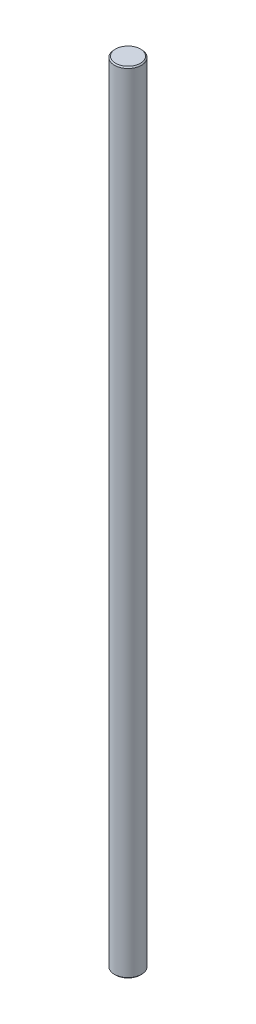
ISO-10303-21;
HEADER;
FILE_DESCRIPTION(('STEP AP214'),'2;1');
FILE_NAME('part.step','',(''),(''),'','','');
FILE_SCHEMA(('AUTOMOTIVE_DESIGN { 1 0 10303 214 1 1 1 1 }'));
ENDSEC;
DATA;
#1=APPLICATION_CONTEXT('core data for automotive mechanical design processes');
#2=APPLICATION_PROTOCOL_DEFINITION('international standard','automotive_design',2000,#1);
#3=PRODUCT_CONTEXT('',#1,'mechanical');
#4=PRODUCT('Part','Part','',(#3));
#5=PRODUCT_RELATED_PRODUCT_CATEGORY('part','',(#4));
#6=PRODUCT_DEFINITION_FORMATION('','',#4);
#7=PRODUCT_DEFINITION_CONTEXT('part definition',#1,'design');
#8=PRODUCT_DEFINITION('design','',#6,#7);
#9=PRODUCT_DEFINITION_SHAPE('','',#8);
#10=(LENGTH_UNIT() NAMED_UNIT(*) SI_UNIT(.MILLI.,.METRE.));
#11=(NAMED_UNIT(*) PLANE_ANGLE_UNIT() SI_UNIT($,.RADIAN.));
#12=(NAMED_UNIT(*) SI_UNIT($,.STERADIAN.) SOLID_ANGLE_UNIT());
#13=UNCERTAINTY_MEASURE_WITH_UNIT(LENGTH_MEASURE(1.E-05),#10,'distance_accuracy_value','');
#14=(GEOMETRIC_REPRESENTATION_CONTEXT(3) GLOBAL_UNCERTAINTY_ASSIGNED_CONTEXT((#13)) GLOBAL_UNIT_ASSIGNED_CONTEXT((#10,
#11,#12)) REPRESENTATION_CONTEXT('',''));
#15=CARTESIAN_POINT('',(0.,0.,0.));
#16=DIRECTION('',(0.,0.,1.));
#17=DIRECTION('',(1.,0.,0.));
#18=AXIS2_PLACEMENT_3D('',#15,#16,#17);
#19=CARTESIAN_POINT('',(0.,175.,0.));
#20=DIRECTION('',(0.,-1.,0.));
#21=DIRECTION('',(0.,0.,-1.));
#22=AXIS2_PLACEMENT_3D('',#19,#20,#21);
#23=CYLINDRICAL_SURFACE('',#22,6.);
#24=CARTESIAN_POINT('',(0.,-174.5,0.));
#25=DIRECTION('',(0.,1.,0.));
#26=DIRECTION('',(0.,0.,1.));
#27=AXIS2_PLACEMENT_3D('',#24,#25,#26);
#28=CIRCLE('',#27,6.);
#29=CARTESIAN_POINT('',(0.,-174.5,6.));
#30=VERTEX_POINT('',#29);
#31=EDGE_CURVE('E46',#30,#30,#28,.T.);
#32=ORIENTED_EDGE('',*,*,#31,.T.);
#33=EDGE_LOOP('',(#32));
#34=FACE_BOUND('',#33,.T.);
#35=CARTESIAN_POINT('',(0.,174.5,0.));
#36=DIRECTION('',(0.,1.,0.));
#37=DIRECTION('',(0.,0.,1.));
#38=AXIS2_PLACEMENT_3D('',#35,#36,#37);
#39=CIRCLE('',#38,6.);
#40=CARTESIAN_POINT('',(0.,174.5,6.));
#41=VERTEX_POINT('',#40);
#42=EDGE_CURVE('E50',#41,#41,#39,.F.);
#43=ORIENTED_EDGE('',*,*,#42,.T.);
#44=EDGE_LOOP('',(#43));
#45=FACE_BOUND('',#44,.T.);
#46=ADVANCED_FACE('F35',(#34,#45),#23,.T.);
#47=CARTESIAN_POINT('',(0.,175.,0.));
#48=DIRECTION('',(0.,1.,0.));
#49=DIRECTION('',(0.,0.,1.));
#50=AXIS2_PLACEMENT_3D('',#47,#48,#49);
#51=PLANE('',#50);
#52=CARTESIAN_POINT('',(0.,175.,0.));
#53=DIRECTION('',(0.,1.,0.));
#54=DIRECTION('',(0.,0.,1.));
#55=AXIS2_PLACEMENT_3D('',#52,#53,#54);
#56=CIRCLE('',#55,5.50000000000001);
#57=CARTESIAN_POINT('',(0.,175.,5.50000000000001));
#58=VERTEX_POINT('',#57);
#59=EDGE_CURVE('E10',#58,#58,#56,.T.);
#60=ORIENTED_EDGE('',*,*,#59,.T.);
#61=EDGE_LOOP('',(#60));
#62=FACE_BOUND('',#61,.T.);
#63=ADVANCED_FACE('F66',(#62),#51,.T.);
#64=CARTESIAN_POINT('',(0.,-175.,0.));
#65=DIRECTION('',(0.,1.,0.));
#66=DIRECTION('',(0.,0.,1.));
#67=AXIS2_PLACEMENT_3D('',#64,#65,#66);
#68=PLANE('',#67);
#69=CARTESIAN_POINT('',(0.,-175.,0.));
#70=DIRECTION('',(0.,1.,0.));
#71=DIRECTION('',(0.,0.,1.));
#72=AXIS2_PLACEMENT_3D('',#69,#70,#71);
#73=CIRCLE('',#72,5.50000000000009);
#74=CARTESIAN_POINT('',(0.,-175.,5.50000000000009));
#75=VERTEX_POINT('',#74);
#76=EDGE_CURVE('E42',#75,#75,#73,.F.);
#77=ORIENTED_EDGE('',*,*,#76,.T.);
#78=EDGE_LOOP('',(#77));
#79=FACE_BOUND('',#78,.T.);
#80=ADVANCED_FACE('F63',(#79),#68,.F.);
#81=CARTESIAN_POINT('',(0.,-174.5,0.));
#82=DIRECTION('',(0.,1.,0.));
#83=DIRECTION('',(0.,0.,1.));
#84=AXIS2_PLACEMENT_3D('',#81,#82,#83);
#85=CONICAL_SURFACE('',#84,6.,0.785398163397416);
#86=ORIENTED_EDGE('',*,*,#76,.F.);
#87=EDGE_LOOP('',(#86));
#88=FACE_BOUND('',#87,.T.);
#89=ORIENTED_EDGE('',*,*,#31,.F.);
#90=EDGE_LOOP('',(#89));
#91=FACE_BOUND('',#90,.T.);
#92=ADVANCED_FACE('F59',(#88,#91),#85,.T.);
#93=CARTESIAN_POINT('',(0.,175.,0.));
#94=DIRECTION('',(0.,-1.,0.));
#95=DIRECTION('',(0.,0.,-1.));
#96=AXIS2_PLACEMENT_3D('',#93,#94,#95);
#97=CONICAL_SURFACE('',#96,5.50000000000001,0.785398163397416);
#98=ORIENTED_EDGE('',*,*,#42,.F.);
#99=EDGE_LOOP('',(#98));
#100=FACE_BOUND('',#99,.T.);
#101=ORIENTED_EDGE('',*,*,#59,.F.);
#102=EDGE_LOOP('',(#101));
#103=FACE_BOUND('',#102,.T.);
#104=ADVANCED_FACE('F37',(#100,#103),#97,.T.);
#105=CLOSED_SHELL('',(#46,#63,#80,#92,#104));
#106=MANIFOLD_SOLID_BREP('B2',#105);
#107=ADVANCED_BREP_SHAPE_REPRESENTATION('',(#18,#106),#14);
#108=SHAPE_DEFINITION_REPRESENTATION(#9,#107);
ENDSEC;
END-ISO-10303-21;
